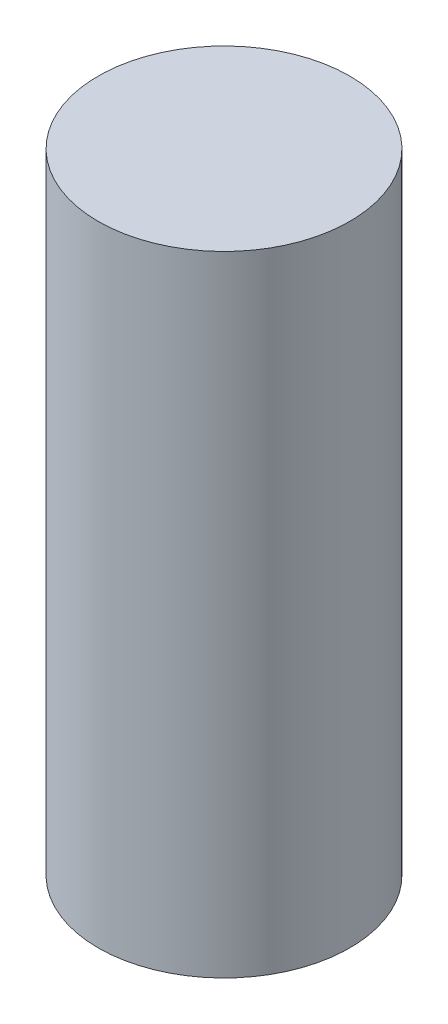
ISO-10303-21;
HEADER;
FILE_DESCRIPTION(('STEP AP214'),'2;1');
FILE_NAME('part.step','',(''),(''),'','','');
FILE_SCHEMA(('AUTOMOTIVE_DESIGN { 1 0 10303 214 1 1 1 1 }'));
ENDSEC;
DATA;
#1=APPLICATION_CONTEXT('core data for automotive mechanical design processes');
#2=APPLICATION_PROTOCOL_DEFINITION('international standard','automotive_design',2000,#1);
#3=PRODUCT_CONTEXT('',#1,'mechanical');
#4=PRODUCT('Part','Part','',(#3));
#5=PRODUCT_RELATED_PRODUCT_CATEGORY('part','',(#4));
#6=PRODUCT_DEFINITION_FORMATION('','',#4);
#7=PRODUCT_DEFINITION_CONTEXT('part definition',#1,'design');
#8=PRODUCT_DEFINITION('design','',#6,#7);
#9=PRODUCT_DEFINITION_SHAPE('','',#8);
#10=(LENGTH_UNIT() NAMED_UNIT(*) SI_UNIT(.MILLI.,.METRE.));
#11=(NAMED_UNIT(*) PLANE_ANGLE_UNIT() SI_UNIT($,.RADIAN.));
#12=(NAMED_UNIT(*) SI_UNIT($,.STERADIAN.) SOLID_ANGLE_UNIT());
#13=UNCERTAINTY_MEASURE_WITH_UNIT(LENGTH_MEASURE(1.E-05),#10,'distance_accuracy_value','');
#14=(GEOMETRIC_REPRESENTATION_CONTEXT(3) GLOBAL_UNCERTAINTY_ASSIGNED_CONTEXT((#13)) GLOBAL_UNIT_ASSIGNED_CONTEXT((#10,
#11,#12)) REPRESENTATION_CONTEXT('',''));
#15=CARTESIAN_POINT('',(0.,0.,0.));
#16=DIRECTION('',(0.,0.,1.));
#17=DIRECTION('',(1.,0.,0.));
#18=AXIS2_PLACEMENT_3D('',#15,#16,#17);
#19=CARTESIAN_POINT('',(0.,0.,0.));
#20=DIRECTION('',(0.,1.,0.));
#21=DIRECTION('',(0.,0.,1.));
#22=AXIS2_PLACEMENT_3D('',#19,#20,#21);
#23=PLANE('',#22);
#24=CARTESIAN_POINT('',(0.,0.,0.));
#25=DIRECTION('',(0.,-1.,0.));
#26=DIRECTION('',(0.,0.,-1.));
#27=AXIS2_PLACEMENT_3D('',#24,#25,#26);
#28=CIRCLE('',#27,38.1);
#29=CARTESIAN_POINT('',(0.,0.,-38.1));
#30=VERTEX_POINT('',#29);
#31=EDGE_CURVE('E10',#30,#30,#28,.T.);
#32=ORIENTED_EDGE('',*,*,#31,.T.);
#33=EDGE_LOOP('',(#32));
#34=FACE_BOUND('',#33,.T.);
#35=ADVANCED_FACE('F37',(#34),#23,.F.);
#36=CARTESIAN_POINT('',(0.,0.,0.));
#37=DIRECTION('',(0.,-1.,0.));
#38=DIRECTION('',(0.,0.,-1.));
#39=AXIS2_PLACEMENT_3D('',#36,#37,#38);
#40=CYLINDRICAL_SURFACE('',#39,38.1);
#41=ORIENTED_EDGE('',*,*,#31,.F.);
#42=EDGE_LOOP('',(#41));
#43=FACE_BOUND('',#42,.T.);
#44=CARTESIAN_POINT('',(0.,190.5,0.));
#45=DIRECTION('',(0.,-1.,0.));
#46=DIRECTION('',(0.,0.,-1.));
#47=AXIS2_PLACEMENT_3D('',#44,#45,#46);
#48=CIRCLE('',#47,38.1);
#49=CARTESIAN_POINT('',(0.,190.5,-38.1));
#50=VERTEX_POINT('',#49);
#51=EDGE_CURVE('E44',#50,#50,#48,.T.);
#52=ORIENTED_EDGE('',*,*,#51,.T.);
#53=EDGE_LOOP('',(#52));
#54=FACE_BOUND('',#53,.T.);
#55=ADVANCED_FACE('F51',(#43,#54),#40,.T.);
#56=CARTESIAN_POINT('',(-38.1,190.5,0.));
#57=DIRECTION('',(0.,-1.,0.));
#58=DIRECTION('',(0.,0.,-1.));
#59=AXIS2_PLACEMENT_3D('',#56,#57,#58);
#60=PLANE('',#59);
#61=ORIENTED_EDGE('',*,*,#51,.F.);
#62=EDGE_LOOP('',(#61));
#63=FACE_BOUND('',#62,.T.);
#64=ADVANCED_FACE('F53',(#63),#60,.F.);
#65=CLOSED_SHELL('',(#35,#55,#64));
#66=MANIFOLD_SOLID_BREP('B2',#65);
#67=ADVANCED_BREP_SHAPE_REPRESENTATION('',(#18,#66),#14);
#68=SHAPE_DEFINITION_REPRESENTATION(#9,#67);
ENDSEC;
END-ISO-10303-21;
